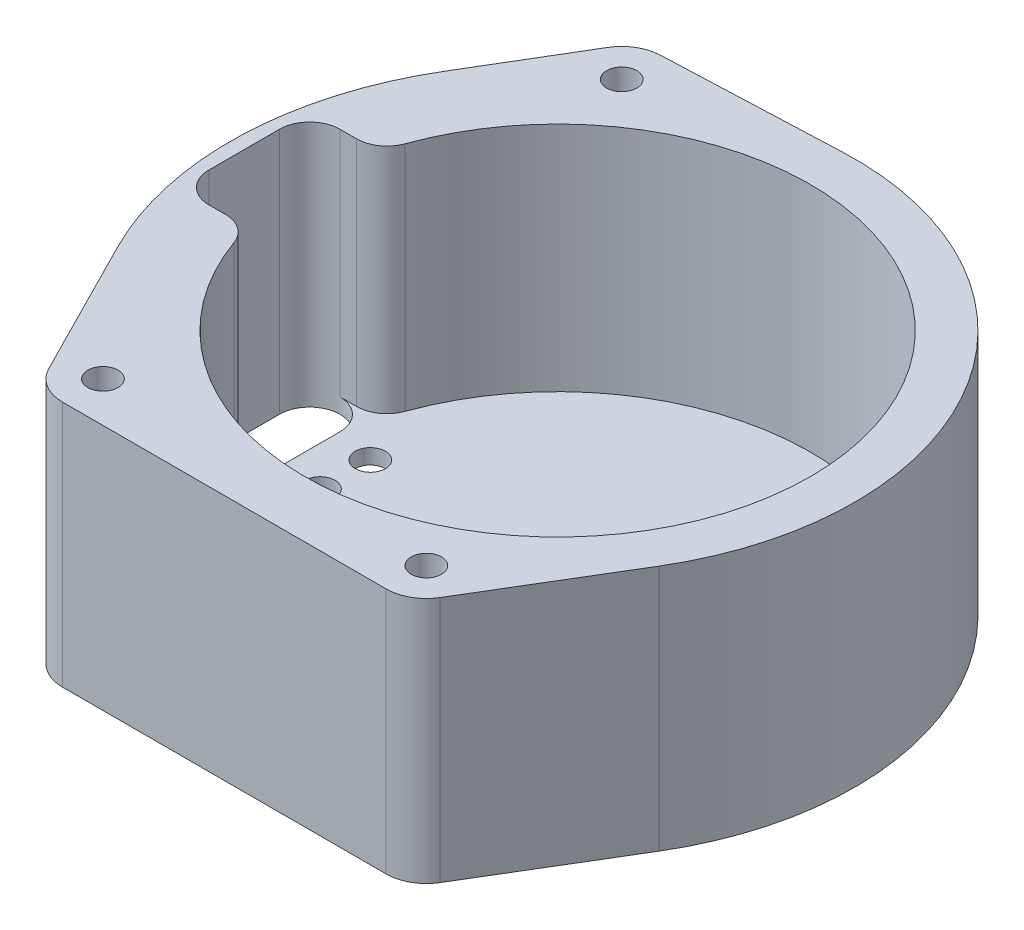
ISO-10303-21;
HEADER;
FILE_DESCRIPTION(('STEP AP214'),'2;1');
FILE_NAME('part.step','',(''),(''),'','','');
FILE_SCHEMA(('AUTOMOTIVE_DESIGN { 1 0 10303 214 1 1 1 1 }'));
ENDSEC;
DATA;
#1=APPLICATION_CONTEXT('core data for automotive mechanical design processes');
#2=APPLICATION_PROTOCOL_DEFINITION('international standard','automotive_design',2000,#1);
#3=PRODUCT_CONTEXT('',#1,'mechanical');
#4=PRODUCT('Part','Part','',(#3));
#5=PRODUCT_RELATED_PRODUCT_CATEGORY('part','',(#4));
#6=PRODUCT_DEFINITION_FORMATION('','',#4);
#7=PRODUCT_DEFINITION_CONTEXT('part definition',#1,'design');
#8=PRODUCT_DEFINITION('design','',#6,#7);
#9=PRODUCT_DEFINITION_SHAPE('','',#8);
#10=(LENGTH_UNIT() NAMED_UNIT(*) SI_UNIT(.MILLI.,.METRE.));
#11=(NAMED_UNIT(*) PLANE_ANGLE_UNIT() SI_UNIT($,.RADIAN.));
#12=(NAMED_UNIT(*) SI_UNIT($,.STERADIAN.) SOLID_ANGLE_UNIT());
#13=UNCERTAINTY_MEASURE_WITH_UNIT(LENGTH_MEASURE(1.E-05),#10,'distance_accuracy_value','');
#14=(GEOMETRIC_REPRESENTATION_CONTEXT(3) GLOBAL_UNCERTAINTY_ASSIGNED_CONTEXT((#13)) GLOBAL_UNIT_ASSIGNED_CONTEXT((#10,
#11,#12)) REPRESENTATION_CONTEXT('',''));
#15=CARTESIAN_POINT('',(0.,0.,0.));
#16=DIRECTION('',(0.,0.,1.));
#17=DIRECTION('',(1.,0.,0.));
#18=AXIS2_PLACEMENT_3D('',#15,#16,#17);
#19=CARTESIAN_POINT('',(-18.4083036841292,23.,26.7110072700086));
#20=DIRECTION('',(0.,1.,0.));
#21=DIRECTION('',(0.,0.,-1.));
#22=AXIS2_PLACEMENT_3D('',#19,#20,#21);
#23=PLANE('',#22);
#24=CARTESIAN_POINT('',(-18.4083036841292,23.,26.7110072700086));
#25=DIRECTION('',(0.,-1.,0.));
#26=DIRECTION('',(0.,0.,-1.));
#27=AXIS2_PLACEMENT_3D('',#24,#25,#26);
#28=CIRCLE('',#27,1.5);
#29=CARTESIAN_POINT('',(-18.4083036841292,23.,25.2110072700086));
#30=VERTEX_POINT('',#29);
#31=EDGE_CURVE('E274',#30,#30,#28,.T.);
#32=ORIENTED_EDGE('',*,*,#31,.T.);
#33=EDGE_LOOP('',(#32));
#34=FACE_BOUND('',#33,.T.);
#35=CARTESIAN_POINT('',(-18.4083036841292,23.,26.7110072700086));
#36=DIRECTION('',(0.,-1.,0.));
#37=DIRECTION('',(0.,0.,-1.));
#38=AXIS2_PLACEMENT_3D('',#35,#36,#37);
#39=CIRCLE('',#38,4.00000000000001);
#40=CARTESIAN_POINT('',(-18.4083036841292,23.,30.7110072700086));
#41=VERTEX_POINT('',#40);
#42=CARTESIAN_POINT('',(-21.9756650888363,23.,28.520408443935));
#43=VERTEX_POINT('',#42);
#44=EDGE_CURVE('E280',#41,#43,#39,.T.);
#45=ORIENTED_EDGE('',*,*,#44,.F.);
#46=DIRECTION('',(-1.,0.,0.));
#47=VECTOR('',#46,1.);
#48=CARTESIAN_POINT('',(-18.4083036841292,23.,30.7110072700086));
#49=LINE('',#48,#47);
#50=CARTESIAN_POINT('',(13.6880172568585,23.,30.7110072700086));
#51=VERTEX_POINT('',#50);
#52=EDGE_CURVE('E307',#51,#41,#49,.T.);
#53=ORIENTED_EDGE('',*,*,#52,.F.);
#54=CARTESIAN_POINT('',(13.6880172568585,23.,26.7110072700086));
#55=DIRECTION('',(0.,-1.,0.));
#56=DIRECTION('',(0.,0.,-1.));
#57=AXIS2_PLACEMENT_3D('',#54,#55,#56);
#58=CIRCLE('',#57,3.99999999999999);
#59=CARTESIAN_POINT('',(17.1153988864222,23.,28.7733009361312));
#60=VERTEX_POINT('',#59);
#61=EDGE_CURVE('E304',#60,#51,#58,.T.);
#62=ORIENTED_EDGE('',*,*,#61,.F.);
#63=DIRECTION('',(-0.515573416530637,0.,0.856845407390928));
#64=VECTOR('',#63,1.);
#65=CARTESIAN_POINT('',(17.1153988864222,23.,28.7733009361312));
#66=LINE('',#65,#64);
#67=CARTESIAN_POINT('',(25.2769395180324,23.,15.2094157876538));
#68=VERTEX_POINT('',#67);
#69=EDGE_CURVE('E301',#68,#60,#66,.T.);
#70=ORIENTED_EDGE('',*,*,#69,.F.);
#71=CARTESIAN_POINT('',(0.,23.,0.));
#72=DIRECTION('',(0.,-1.,0.));
#73=DIRECTION('',(0.,0.,-1.));
#74=AXIS2_PLACEMENT_3D('',#71,#72,#73);
#75=CIRCLE('',#74,29.5);
#76=CARTESIAN_POINT('',(-1.20515878453155,23.,-29.4753726406311));
#77=VERTEX_POINT('',#76);
#78=EDGE_CURVE('E298',#77,#68,#75,.T.);
#79=ORIENTED_EDGE('',*,*,#78,.F.);
#80=DIRECTION('',(0.999165174258683,0.,-0.0408528401536111));
#81=VECTOR('',#80,1.);
#82=CARTESIAN_POINT('',(-18.5717150447436,23.,-28.7653067123991));
#83=LINE('',#82,#81);
#84=CARTESIAN_POINT('',(-18.5717150447436,23.,-28.7653067123991));
#85=VERTEX_POINT('',#84);
#86=EDGE_CURVE('E295',#85,#77,#83,.T.);
#87=ORIENTED_EDGE('',*,*,#86,.F.);
#88=CARTESIAN_POINT('',(-18.4083036841292,23.,-24.7686460153643));
#89=DIRECTION('',(0.,-1.,0.));
#90=DIRECTION('',(0.,0.,-1.));
#91=AXIS2_PLACEMENT_3D('',#88,#89,#90);
#92=CIRCLE('',#91,4.);
#93=CARTESIAN_POINT('',(-21.8432095508813,23.,-26.8183829952113));
#94=VERTEX_POINT('',#93);
#95=EDGE_CURVE('E292',#94,#85,#92,.T.);
#96=ORIENTED_EDGE('',*,*,#95,.F.);
#97=DIRECTION('',(0.512434244961728,0.,-0.858726466688027));
#98=VECTOR('',#97,1.);
#99=CARTESIAN_POINT('',(-21.8432095508813,23.,-26.8183829952113));
#100=LINE('',#99,#98);
#101=CARTESIAN_POINT('',(-27.9086101673609,23.,-16.6541129612562));
#102=VERTEX_POINT('',#101);
#103=EDGE_CURVE('E289',#102,#94,#100,.T.);
#104=ORIENTED_EDGE('',*,*,#103,.F.);
#105=CARTESIAN_POINT('',(0.,23.,0.));
#106=DIRECTION('',(0.,-1.,0.));
#107=DIRECTION('',(0.,0.,-1.));
#108=AXIS2_PLACEMENT_3D('',#105,#106,#107);
#109=CIRCLE('',#108,32.5);
#110=CARTESIAN_POINT('',(-28.9848114132452,23.,14.701384538152));
#111=VERTEX_POINT('',#110);
#112=EDGE_CURVE('E286',#111,#102,#109,.T.);
#113=ORIENTED_EDGE('',*,*,#112,.F.);
#114=DIRECTION('',(-0.452350293481598,0.,-0.891840351176774));
#115=VECTOR('',#114,1.);
#116=CARTESIAN_POINT('',(-28.9848114132452,23.,14.7013845381519));
#117=LINE('',#116,#115);
#118=EDGE_CURVE('E283',#43,#111,#117,.T.);
#119=ORIENTED_EDGE('',*,*,#118,.F.);
#120=EDGE_LOOP('',(#45,#53,#62,#70,#79,#87,#96,#104,#113,#119));
#121=FACE_BOUND('',#120,.T.);
#122=CARTESIAN_POINT('',(13.6880172568585,23.,26.7110072700086));
#123=DIRECTION('',(0.,-1.,0.));
#124=DIRECTION('',(0.,0.,-1.));
#125=AXIS2_PLACEMENT_3D('',#122,#123,#124);
#126=CIRCLE('',#125,1.5);
#127=CARTESIAN_POINT('',(13.6880172568585,23.,25.2110072700086));
#128=VERTEX_POINT('',#127);
#129=EDGE_CURVE('E277',#128,#128,#126,.T.);
#130=ORIENTED_EDGE('',*,*,#129,.T.);
#131=EDGE_LOOP('',(#130));
#132=FACE_BOUND('',#131,.T.);
#133=CARTESIAN_POINT('',(-18.4083036841292,23.,-24.7686460153643));
#134=DIRECTION('',(0.,-1.,0.));
#135=DIRECTION('',(0.,0.,-1.));
#136=AXIS2_PLACEMENT_3D('',#133,#134,#135);
#137=CIRCLE('',#136,1.5);
#138=CARTESIAN_POINT('',(-18.4083036841292,23.,-26.2686460153643));
#139=VERTEX_POINT('',#138);
#140=EDGE_CURVE('E265',#139,#139,#137,.T.);
#141=ORIENTED_EDGE('',*,*,#140,.T.);
#142=EDGE_LOOP('',(#141));
#143=FACE_BOUND('',#142,.T.);
#144=CARTESIAN_POINT('',(0.,23.,0.));
#145=DIRECTION('',(0.,-1.,0.));
#146=DIRECTION('',(0.,0.,-1.));
#147=AXIS2_PLACEMENT_3D('',#144,#145,#146);
#148=CIRCLE('',#147,25.1);
#149=CARTESIAN_POINT('',(-23.6220615156866,23.,-8.48576512455516));
#150=VERTEX_POINT('',#149);
#151=CARTESIAN_POINT('',(-23.6220615156866,23.,8.48576512455516));
#152=VERTEX_POINT('',#151);
#153=EDGE_CURVE('E256',#150,#152,#148,.T.);
#154=ORIENTED_EDGE('',*,*,#153,.T.);
#155=CARTESIAN_POINT('',(-26.445415481705,23.,9.5));
#156=DIRECTION('',(0.,-1.,0.));
#157=DIRECTION('',(0.,0.,-1.));
#158=AXIS2_PLACEMENT_3D('',#155,#156,#157);
#159=CIRCLE('',#158,3.);
#160=CARTESIAN_POINT('',(-26.445415481705,23.,6.5));
#161=VERTEX_POINT('',#160);
#162=EDGE_CURVE('E354',#161,#152,#159,.T.);
#163=ORIENTED_EDGE('',*,*,#162,.F.);
#164=DIRECTION('',(-1.,0.,0.));
#165=VECTOR('',#164,1.);
#166=CARTESIAN_POINT('',(-31.1,23.,6.5));
#167=LINE('',#166,#165);
#168=CARTESIAN_POINT('',(-28.1,23.,6.5));
#169=VERTEX_POINT('',#168);
#170=EDGE_CURVE('E260',#161,#169,#167,.T.);
#171=ORIENTED_EDGE('',*,*,#170,.T.);
#172=CARTESIAN_POINT('',(-28.1,23.,3.5));
#173=DIRECTION('',(0.,-1.,0.));
#174=DIRECTION('',(0.,0.,-1.));
#175=AXIS2_PLACEMENT_3D('',#172,#173,#174);
#176=CIRCLE('',#175,3.);
#177=CARTESIAN_POINT('',(-31.1,23.,3.5));
#178=VERTEX_POINT('',#177);
#179=EDGE_CURVE('E11',#178,#169,#176,.F.);
#180=ORIENTED_EDGE('',*,*,#179,.F.);
#181=DIRECTION('',(0.,0.,-1.));
#182=VECTOR('',#181,1.);
#183=CARTESIAN_POINT('',(-31.1,23.,-6.5));
#184=LINE('',#183,#182);
#185=CARTESIAN_POINT('',(-31.1,23.,-3.5));
#186=VERTEX_POINT('',#185);
#187=EDGE_CURVE('E263',#178,#186,#184,.T.);
#188=ORIENTED_EDGE('',*,*,#187,.T.);
#189=CARTESIAN_POINT('',(-28.1,23.,-3.5));
#190=DIRECTION('',(0.,-1.,0.));
#191=DIRECTION('',(0.,0.,-1.));
#192=AXIS2_PLACEMENT_3D('',#189,#190,#191);
#193=CIRCLE('',#192,3.);
#194=CARTESIAN_POINT('',(-28.1,23.,-6.5));
#195=VERTEX_POINT('',#194);
#196=EDGE_CURVE('E45',#195,#186,#193,.F.);
#197=ORIENTED_EDGE('',*,*,#196,.F.);
#198=DIRECTION('',(1.,0.,0.));
#199=VECTOR('',#198,1.);
#200=CARTESIAN_POINT('',(-31.1,23.,-6.5));
#201=LINE('',#200,#199);
#202=CARTESIAN_POINT('',(-26.445415481705,23.,-6.5));
#203=VERTEX_POINT('',#202);
#204=EDGE_CURVE('E253',#195,#203,#201,.T.);
#205=ORIENTED_EDGE('',*,*,#204,.T.);
#206=CARTESIAN_POINT('',(-26.445415481705,23.,-9.5));
#207=DIRECTION('',(0.,-1.,0.));
#208=DIRECTION('',(0.,0.,-1.));
#209=AXIS2_PLACEMENT_3D('',#206,#207,#208);
#210=CIRCLE('',#209,3.);
#211=EDGE_CURVE('E356',#150,#203,#210,.T.);
#212=ORIENTED_EDGE('',*,*,#211,.F.);
#213=EDGE_LOOP('',(#154,#163,#171,#180,#188,#197,#205,#212));
#214=FACE_BOUND('',#213,.T.);
#215=ADVANCED_FACE('F37',(#34,#121,#132,#143,#214),#23,.T.);
#216=CARTESIAN_POINT('',(-18.4083036841292,23.,26.7110072700086));
#217=DIRECTION('',(0.,-1.,0.));
#218=DIRECTION('',(0.,0.,1.));
#219=AXIS2_PLACEMENT_3D('',#216,#217,#218);
#220=CYLINDRICAL_SURFACE('',#219,4.00000000000001);
#221=DIRECTION('',(0.,-1.,0.));
#222=VECTOR('',#221,1.);
#223=CARTESIAN_POINT('',(-18.4083036841292,23.,30.7110072700086));
#224=LINE('',#223,#222);
#225=CARTESIAN_POINT('',(-18.4083036841292,-1.5,30.7110072700086));
#226=VERTEX_POINT('',#225);
#227=EDGE_CURVE('E310',#41,#226,#224,.T.);
#228=ORIENTED_EDGE('',*,*,#227,.F.);
#229=ORIENTED_EDGE('',*,*,#44,.T.);
#230=DIRECTION('',(0.,-1.,0.));
#231=VECTOR('',#230,1.);
#232=CARTESIAN_POINT('',(-21.9756650888363,23.,28.520408443935));
#233=LINE('',#232,#231);
#234=CARTESIAN_POINT('',(-21.9756650888363,-1.5,28.520408443935));
#235=VERTEX_POINT('',#234);
#236=EDGE_CURVE('E337',#43,#235,#233,.T.);
#237=ORIENTED_EDGE('',*,*,#236,.T.);
#238=CARTESIAN_POINT('',(-18.4083036841292,-1.5,26.7110072700086));
#239=DIRECTION('',(0.,1.,0.));
#240=DIRECTION('',(0.,0.,1.));
#241=AXIS2_PLACEMENT_3D('',#238,#239,#240);
#242=CIRCLE('',#241,4.);
#243=EDGE_CURVE('E229',#235,#226,#242,.T.);
#244=ORIENTED_EDGE('',*,*,#243,.T.);
#245=EDGE_LOOP('',(#228,#229,#237,#244));
#246=FACE_BOUND('',#245,.T.);
#247=ADVANCED_FACE('F395',(#246),#220,.T.);
#248=CARTESIAN_POINT('',(-28.9848114132452,23.,14.7013845381519));
#249=DIRECTION('',(0.891840351176774,0.,-0.452350293481598));
#250=DIRECTION('',(0.452350293481598,0.,0.891840351176775));
#251=AXIS2_PLACEMENT_3D('',#248,#249,#250);
#252=PLANE('',#251);
#253=ORIENTED_EDGE('',*,*,#236,.F.);
#254=ORIENTED_EDGE('',*,*,#118,.T.);
#255=DIRECTION('',(0.,-1.,0.));
#256=VECTOR('',#255,1.);
#257=CARTESIAN_POINT('',(-28.9848114132452,23.,14.701384538152));
#258=LINE('',#257,#256);
#259=CARTESIAN_POINT('',(-28.9848114132452,-1.5,14.701384538152));
#260=VERTEX_POINT('',#259);
#261=EDGE_CURVE('E334',#111,#260,#258,.T.);
#262=ORIENTED_EDGE('',*,*,#261,.T.);
#263=DIRECTION('',(0.452350293481598,0.,0.891840351176774));
#264=VECTOR('',#263,1.);
#265=CARTESIAN_POINT('',(-28.9848114132452,-1.5,14.701384538152));
#266=LINE('',#265,#264);
#267=EDGE_CURVE('E250',#260,#235,#266,.T.);
#268=ORIENTED_EDGE('',*,*,#267,.T.);
#269=EDGE_LOOP('',(#253,#254,#262,#268));
#270=FACE_BOUND('',#269,.T.);
#271=ADVANCED_FACE('F401',(#270),#252,.F.);
#272=CARTESIAN_POINT('',(0.,23.,0.));
#273=DIRECTION('',(0.,-1.,0.));
#274=DIRECTION('',(0.,0.,1.));
#275=AXIS2_PLACEMENT_3D('',#272,#273,#274);
#276=CYLINDRICAL_SURFACE('',#275,32.5);
#277=ORIENTED_EDGE('',*,*,#261,.F.);
#278=ORIENTED_EDGE('',*,*,#112,.T.);
#279=DIRECTION('',(0.,-1.,0.));
#280=VECTOR('',#279,1.);
#281=CARTESIAN_POINT('',(-27.9086101673609,23.,-16.6541129612562));
#282=LINE('',#281,#280);
#283=CARTESIAN_POINT('',(-27.9086101673609,-1.5,-16.6541129612562));
#284=VERTEX_POINT('',#283);
#285=EDGE_CURVE('E331',#102,#284,#282,.T.);
#286=ORIENTED_EDGE('',*,*,#285,.T.);
#287=CARTESIAN_POINT('',(0.,-1.5,0.));
#288=DIRECTION('',(0.,1.,0.));
#289=DIRECTION('',(0.,0.,1.));
#290=AXIS2_PLACEMENT_3D('',#287,#288,#289);
#291=CIRCLE('',#290,32.5);
#292=EDGE_CURVE('E248',#284,#260,#291,.T.);
#293=ORIENTED_EDGE('',*,*,#292,.T.);
#294=EDGE_LOOP('',(#277,#278,#286,#293));
#295=FACE_BOUND('',#294,.T.);
#296=ADVANCED_FACE('F436',(#295),#276,.T.);
#297=CARTESIAN_POINT('',(-21.8432095508813,23.,-26.8183829952113));
#298=DIRECTION('',(0.858726466688028,0.,0.512434244961728));
#299=DIRECTION('',(-0.512434244961728,0.,0.858726466688028));
#300=AXIS2_PLACEMENT_3D('',#297,#298,#299);
#301=PLANE('',#300);
#302=ORIENTED_EDGE('',*,*,#285,.F.);
#303=ORIENTED_EDGE('',*,*,#103,.T.);
#304=DIRECTION('',(0.,-1.,0.));
#305=VECTOR('',#304,1.);
#306=CARTESIAN_POINT('',(-21.8432095508813,23.,-26.8183829952113));
#307=LINE('',#306,#305);
#308=CARTESIAN_POINT('',(-21.8432095508813,-1.5,-26.8183829952113));
#309=VERTEX_POINT('',#308);
#310=EDGE_CURVE('E328',#94,#309,#307,.T.);
#311=ORIENTED_EDGE('',*,*,#310,.T.);
#312=DIRECTION('',(-0.512434244961728,0.,0.858726466688027));
#313=VECTOR('',#312,1.);
#314=CARTESIAN_POINT('',(-21.8432095508813,-1.5,-26.8183829952113));
#315=LINE('',#314,#313);
#316=EDGE_CURVE('E246',#309,#284,#315,.T.);
#317=ORIENTED_EDGE('',*,*,#316,.T.);
#318=EDGE_LOOP('',(#302,#303,#311,#317));
#319=FACE_BOUND('',#318,.T.);
#320=ADVANCED_FACE('F432',(#319),#301,.F.);
#321=CARTESIAN_POINT('',(-18.4083036841292,23.,-24.7686460153643));
#322=DIRECTION('',(0.,-1.,0.));
#323=DIRECTION('',(0.,0.,1.));
#324=AXIS2_PLACEMENT_3D('',#321,#322,#323);
#325=CYLINDRICAL_SURFACE('',#324,4.);
#326=ORIENTED_EDGE('',*,*,#310,.F.);
#327=ORIENTED_EDGE('',*,*,#95,.T.);
#328=DIRECTION('',(0.,-1.,0.));
#329=VECTOR('',#328,1.);
#330=CARTESIAN_POINT('',(-18.5717150447436,23.,-28.7653067123991));
#331=LINE('',#330,#329);
#332=CARTESIAN_POINT('',(-18.5717150447436,-1.5,-28.7653067123991));
#333=VERTEX_POINT('',#332);
#334=EDGE_CURVE('E325',#85,#333,#331,.T.);
#335=ORIENTED_EDGE('',*,*,#334,.T.);
#336=CARTESIAN_POINT('',(-18.4083036841292,-1.5,-24.7686460153643));
#337=DIRECTION('',(0.,1.,0.));
#338=DIRECTION('',(0.,0.,1.));
#339=AXIS2_PLACEMENT_3D('',#336,#337,#338);
#340=CIRCLE('',#339,4.);
#341=EDGE_CURVE('E244',#333,#309,#340,.T.);
#342=ORIENTED_EDGE('',*,*,#341,.T.);
#343=EDGE_LOOP('',(#326,#327,#335,#342));
#344=FACE_BOUND('',#343,.T.);
#345=ADVANCED_FACE('F428',(#344),#325,.T.);
#346=CARTESIAN_POINT('',(-18.5717150447436,23.,-28.7653067123991));
#347=DIRECTION('',(0.0408528401536111,0.,0.999165174258682));
#348=DIRECTION('',(-0.999165174258683,0.,0.0408528401536111));
#349=AXIS2_PLACEMENT_3D('',#346,#347,#348);
#350=PLANE('',#349);
#351=ORIENTED_EDGE('',*,*,#334,.F.);
#352=ORIENTED_EDGE('',*,*,#86,.T.);
#353=DIRECTION('',(0.,-1.,0.));
#354=VECTOR('',#353,1.);
#355=CARTESIAN_POINT('',(-1.20515878453155,23.,-29.4753726406311));
#356=LINE('',#355,#354);
#357=CARTESIAN_POINT('',(-1.20515878453154,-1.5,-29.4753726406311));
#358=VERTEX_POINT('',#357);
#359=EDGE_CURVE('E322',#77,#358,#356,.T.);
#360=ORIENTED_EDGE('',*,*,#359,.T.);
#361=DIRECTION('',(-0.999165174258683,0.,0.0408528401536111));
#362=VECTOR('',#361,1.);
#363=CARTESIAN_POINT('',(-1.20515878453154,-1.5,-29.4753726406311));
#364=LINE('',#363,#362);
#365=EDGE_CURVE('E242',#358,#333,#364,.T.);
#366=ORIENTED_EDGE('',*,*,#365,.T.);
#367=EDGE_LOOP('',(#351,#352,#360,#366));
#368=FACE_BOUND('',#367,.T.);
#369=ADVANCED_FACE('F424',(#368),#350,.F.);
#370=CARTESIAN_POINT('',(0.,23.,0.));
#371=DIRECTION('',(0.,-1.,0.));
#372=DIRECTION('',(0.,0.,1.));
#373=AXIS2_PLACEMENT_3D('',#370,#371,#372);
#374=CYLINDRICAL_SURFACE('',#373,29.5);
#375=ORIENTED_EDGE('',*,*,#359,.F.);
#376=ORIENTED_EDGE('',*,*,#78,.T.);
#377=DIRECTION('',(0.,-1.,0.));
#378=VECTOR('',#377,1.);
#379=CARTESIAN_POINT('',(25.2769395180324,23.,15.2094157876538));
#380=LINE('',#379,#378);
#381=CARTESIAN_POINT('',(25.2769395180324,-1.5,15.2094157876538));
#382=VERTEX_POINT('',#381);
#383=EDGE_CURVE('E319',#68,#382,#380,.T.);
#384=ORIENTED_EDGE('',*,*,#383,.T.);
#385=CARTESIAN_POINT('',(0.,-1.5,0.));
#386=DIRECTION('',(0.,1.,0.));
#387=DIRECTION('',(0.,0.,1.));
#388=AXIS2_PLACEMENT_3D('',#385,#386,#387);
#389=CIRCLE('',#388,29.5);
#390=EDGE_CURVE('E240',#382,#358,#389,.T.);
#391=ORIENTED_EDGE('',*,*,#390,.T.);
#392=EDGE_LOOP('',(#375,#376,#384,#391));
#393=FACE_BOUND('',#392,.T.);
#394=ADVANCED_FACE('F420',(#393),#374,.T.);
#395=CARTESIAN_POINT('',(17.1153988864222,23.,28.7733009361312));
#396=DIRECTION('',(-0.856845407390929,0.,-0.515573416530637));
#397=DIRECTION('',(0.515573416530637,0.,-0.856845407390929));
#398=AXIS2_PLACEMENT_3D('',#395,#396,#397);
#399=PLANE('',#398);
#400=ORIENTED_EDGE('',*,*,#383,.F.);
#401=ORIENTED_EDGE('',*,*,#69,.T.);
#402=DIRECTION('',(0.,-1.,0.));
#403=VECTOR('',#402,1.);
#404=CARTESIAN_POINT('',(17.1153988864222,23.,28.7733009361312));
#405=LINE('',#404,#403);
#406=CARTESIAN_POINT('',(17.1153988864222,-1.5,28.7733009361312));
#407=VERTEX_POINT('',#406);
#408=EDGE_CURVE('E316',#60,#407,#405,.T.);
#409=ORIENTED_EDGE('',*,*,#408,.T.);
#410=DIRECTION('',(0.515573416530637,0.,-0.856845407390929));
#411=VECTOR('',#410,1.);
#412=CARTESIAN_POINT('',(17.1153988864222,-1.5,28.7733009361312));
#413=LINE('',#412,#411);
#414=EDGE_CURVE('E238',#407,#382,#413,.T.);
#415=ORIENTED_EDGE('',*,*,#414,.T.);
#416=EDGE_LOOP('',(#400,#401,#409,#415));
#417=FACE_BOUND('',#416,.T.);
#418=ADVANCED_FACE('F416',(#417),#399,.F.);
#419=CARTESIAN_POINT('',(13.6880172568585,23.,26.7110072700086));
#420=DIRECTION('',(0.,-1.,0.));
#421=DIRECTION('',(0.,0.,1.));
#422=AXIS2_PLACEMENT_3D('',#419,#420,#421);
#423=CYLINDRICAL_SURFACE('',#422,3.99999999999999);
#424=ORIENTED_EDGE('',*,*,#408,.F.);
#425=ORIENTED_EDGE('',*,*,#61,.T.);
#426=DIRECTION('',(0.,-1.,0.));
#427=VECTOR('',#426,1.);
#428=CARTESIAN_POINT('',(13.6880172568585,23.,30.7110072700086));
#429=LINE('',#428,#427);
#430=CARTESIAN_POINT('',(13.6880172568585,-1.5,30.7110072700086));
#431=VERTEX_POINT('',#430);
#432=EDGE_CURVE('E313',#51,#431,#429,.T.);
#433=ORIENTED_EDGE('',*,*,#432,.T.);
#434=CARTESIAN_POINT('',(13.6880172568585,-1.5,26.7110072700086));
#435=DIRECTION('',(0.,1.,0.));
#436=DIRECTION('',(0.,0.,1.));
#437=AXIS2_PLACEMENT_3D('',#434,#435,#436);
#438=CIRCLE('',#437,4.);
#439=EDGE_CURVE('E236',#431,#407,#438,.T.);
#440=ORIENTED_EDGE('',*,*,#439,.T.);
#441=EDGE_LOOP('',(#424,#425,#433,#440));
#442=FACE_BOUND('',#441,.T.);
#443=ADVANCED_FACE('F412',(#442),#423,.T.);
#444=CARTESIAN_POINT('',(-18.4083036841292,23.,30.7110072700086));
#445=DIRECTION('',(0.,0.,-1.));
#446=DIRECTION('',(1.,0.,0.));
#447=AXIS2_PLACEMENT_3D('',#444,#445,#446);
#448=PLANE('',#447);
#449=ORIENTED_EDGE('',*,*,#432,.F.);
#450=ORIENTED_EDGE('',*,*,#52,.T.);
#451=ORIENTED_EDGE('',*,*,#227,.T.);
#452=DIRECTION('',(1.,0.,0.));
#453=VECTOR('',#452,1.);
#454=CARTESIAN_POINT('',(-18.4083036841292,-1.5,30.7110072700086));
#455=LINE('',#454,#453);
#456=EDGE_CURVE('E234',#226,#431,#455,.T.);
#457=ORIENTED_EDGE('',*,*,#456,.T.);
#458=EDGE_LOOP('',(#449,#450,#451,#457));
#459=FACE_BOUND('',#458,.T.);
#460=ADVANCED_FACE('F409',(#459),#448,.F.);
#461=CARTESIAN_POINT('',(13.6880172568585,23.,26.7110072700086));
#462=DIRECTION('',(0.,-1.,0.));
#463=DIRECTION('',(0.,0.,1.));
#464=AXIS2_PLACEMENT_3D('',#461,#462,#463);
#465=CYLINDRICAL_SURFACE('',#464,1.5);
#466=ORIENTED_EDGE('',*,*,#129,.F.);
#467=EDGE_LOOP('',(#466));
#468=FACE_BOUND('',#467,.T.);
#469=CARTESIAN_POINT('',(13.6880172568585,-1.5,26.7110072700086));
#470=DIRECTION('',(0.,1.,0.));
#471=DIRECTION('',(0.,0.,1.));
#472=AXIS2_PLACEMENT_3D('',#469,#470,#471);
#473=CIRCLE('',#472,1.5);
#474=CARTESIAN_POINT('',(13.6880172568585,-1.5,28.2110072700086));
#475=VERTEX_POINT('',#474);
#476=EDGE_CURVE('E222',#475,#475,#473,.T.);
#477=ORIENTED_EDGE('',*,*,#476,.F.);
#478=EDGE_LOOP('',(#477));
#479=FACE_BOUND('',#478,.T.);
#480=ADVANCED_FACE('F407',(#468,#479),#465,.F.);
#481=CARTESIAN_POINT('',(-18.4083036841292,23.,26.7110072700086));
#482=DIRECTION('',(0.,-1.,0.));
#483=DIRECTION('',(0.,0.,1.));
#484=AXIS2_PLACEMENT_3D('',#481,#482,#483);
#485=CYLINDRICAL_SURFACE('',#484,1.5);
#486=ORIENTED_EDGE('',*,*,#31,.F.);
#487=EDGE_LOOP('',(#486));
#488=FACE_BOUND('',#487,.T.);
#489=CARTESIAN_POINT('',(-18.4083036841292,-1.5,26.7110072700086));
#490=DIRECTION('',(0.,1.,0.));
#491=DIRECTION('',(0.,0.,1.));
#492=AXIS2_PLACEMENT_3D('',#489,#490,#491);
#493=CIRCLE('',#492,1.5);
#494=CARTESIAN_POINT('',(-18.4083036841292,-1.5,28.2110072700086));
#495=VERTEX_POINT('',#494);
#496=EDGE_CURVE('E219',#495,#495,#493,.T.);
#497=ORIENTED_EDGE('',*,*,#496,.F.);
#498=EDGE_LOOP('',(#497));
#499=FACE_BOUND('',#498,.T.);
#500=ADVANCED_FACE('F477',(#488,#499),#485,.F.);
#501=CARTESIAN_POINT('',(-18.4083036841292,23.,-24.7686460153643));
#502=DIRECTION('',(0.,-1.,0.));
#503=DIRECTION('',(0.,0.,1.));
#504=AXIS2_PLACEMENT_3D('',#501,#502,#503);
#505=CYLINDRICAL_SURFACE('',#504,1.5);
#506=ORIENTED_EDGE('',*,*,#140,.F.);
#507=EDGE_LOOP('',(#506));
#508=FACE_BOUND('',#507,.T.);
#509=CARTESIAN_POINT('',(-18.4083036841292,-1.5,-24.7686460153643));
#510=DIRECTION('',(0.,1.,0.));
#511=DIRECTION('',(0.,0.,1.));
#512=AXIS2_PLACEMENT_3D('',#509,#510,#511);
#513=CIRCLE('',#512,1.5);
#514=CARTESIAN_POINT('',(-18.4083036841292,-1.5,-23.2686460153643));
#515=VERTEX_POINT('',#514);
#516=EDGE_CURVE('E216',#515,#515,#513,.T.);
#517=ORIENTED_EDGE('',*,*,#516,.F.);
#518=EDGE_LOOP('',(#517));
#519=FACE_BOUND('',#518,.T.);
#520=ADVANCED_FACE('F475',(#508,#519),#505,.F.);
#521=CARTESIAN_POINT('',(-31.1,23.,-6.5));
#522=DIRECTION('',(0.,0.,1.));
#523=DIRECTION('',(-1.,0.,0.));
#524=AXIS2_PLACEMENT_3D('',#521,#522,#523);
#525=PLANE('',#524);
#526=ORIENTED_EDGE('',*,*,#204,.F.);
#527=DIRECTION('',(0.,-1.,0.));
#528=VECTOR('',#527,1.);
#529=CARTESIAN_POINT('',(-28.1,23.,-6.5));
#530=LINE('',#529,#528);
#531=CARTESIAN_POINT('',(-28.1,0.,-6.5));
#532=VERTEX_POINT('',#531);
#533=EDGE_CURVE('E340',#532,#195,#530,.F.);
#534=ORIENTED_EDGE('',*,*,#533,.F.);
#535=DIRECTION('',(1.,0.,0.));
#536=VECTOR('',#535,1.);
#537=CARTESIAN_POINT('',(-31.1,0.,-6.5));
#538=LINE('',#537,#536);
#539=CARTESIAN_POINT('',(-26.445415481705,0.,-6.5));
#540=VERTEX_POINT('',#539);
#541=EDGE_CURVE('E252',#532,#540,#538,.T.);
#542=ORIENTED_EDGE('',*,*,#541,.T.);
#543=DIRECTION('',(0.,-1.,0.));
#544=VECTOR('',#543,1.);
#545=CARTESIAN_POINT('',(-26.445415481705,23.,-6.5));
#546=LINE('',#545,#544);
#547=EDGE_CURVE('E342',#203,#540,#546,.T.);
#548=ORIENTED_EDGE('',*,*,#547,.F.);
#549=EDGE_LOOP('',(#526,#534,#542,#548));
#550=FACE_BOUND('',#549,.T.);
#551=ADVANCED_FACE('F378',(#550),#525,.T.);
#552=CARTESIAN_POINT('',(0.,23.,0.));
#553=DIRECTION('',(0.,-1.,0.));
#554=DIRECTION('',(0.,0.,1.));
#555=AXIS2_PLACEMENT_3D('',#552,#553,#554);
#556=CYLINDRICAL_SURFACE('',#555,25.1);
#557=CARTESIAN_POINT('',(0.,0.,0.));
#558=DIRECTION('',(0.,-1.,0.));
#559=DIRECTION('',(0.,0.,-1.));
#560=AXIS2_PLACEMENT_3D('',#557,#558,#559);
#561=CIRCLE('',#560,25.1);
#562=CARTESIAN_POINT('',(-23.6220615156866,0.,-8.48576512455516));
#563=VERTEX_POINT('',#562);
#564=CARTESIAN_POINT('',(-23.6220615156866,0.,8.48576512455516));
#565=VERTEX_POINT('',#564);
#566=EDGE_CURVE('E268',#563,#565,#561,.T.);
#567=ORIENTED_EDGE('',*,*,#566,.T.);
#568=DIRECTION('',(0.,-1.,0.));
#569=VECTOR('',#568,1.);
#570=CARTESIAN_POINT('',(-23.6220615156866,23.,8.48576512455516));
#571=LINE('',#570,#569);
#572=EDGE_CURVE('E349',#152,#565,#571,.T.);
#573=ORIENTED_EDGE('',*,*,#572,.F.);
#574=ORIENTED_EDGE('',*,*,#153,.F.);
#575=DIRECTION('',(0.,-1.,0.));
#576=VECTOR('',#575,1.);
#577=CARTESIAN_POINT('',(-23.6220615156866,23.,-8.48576512455516));
#578=LINE('',#577,#576);
#579=EDGE_CURVE('E352',#563,#150,#578,.F.);
#580=ORIENTED_EDGE('',*,*,#579,.F.);
#581=EDGE_LOOP('',(#567,#573,#574,#580));
#582=FACE_BOUND('',#581,.T.);
#583=ADVANCED_FACE('F384',(#582),#556,.F.);
#584=CARTESIAN_POINT('',(-31.1,23.,6.5));
#585=DIRECTION('',(0.,0.,-1.));
#586=DIRECTION('',(1.,0.,0.));
#587=AXIS2_PLACEMENT_3D('',#584,#585,#586);
#588=PLANE('',#587);
#589=DIRECTION('',(-1.,0.,0.));
#590=VECTOR('',#589,1.);
#591=CARTESIAN_POINT('',(-31.1,0.,6.5));
#592=LINE('',#591,#590);
#593=CARTESIAN_POINT('',(-26.445415481705,0.,6.5));
#594=VERTEX_POINT('',#593);
#595=CARTESIAN_POINT('',(-28.1,0.,6.5));
#596=VERTEX_POINT('',#595);
#597=EDGE_CURVE('E257',#594,#596,#592,.T.);
#598=ORIENTED_EDGE('',*,*,#597,.T.);
#599=DIRECTION('',(0.,-1.,0.));
#600=VECTOR('',#599,1.);
#601=CARTESIAN_POINT('',(-28.1,0.,6.5));
#602=LINE('',#601,#600);
#603=EDGE_CURVE('E52',#169,#596,#602,.T.);
#604=ORIENTED_EDGE('',*,*,#603,.F.);
#605=ORIENTED_EDGE('',*,*,#170,.F.);
#606=DIRECTION('',(0.,-1.,0.));
#607=VECTOR('',#606,1.);
#608=CARTESIAN_POINT('',(-26.445415481705,23.,6.5));
#609=LINE('',#608,#607);
#610=EDGE_CURVE('E59',#594,#161,#609,.F.);
#611=ORIENTED_EDGE('',*,*,#610,.F.);
#612=EDGE_LOOP('',(#598,#604,#605,#611));
#613=FACE_BOUND('',#612,.T.);
#614=ADVANCED_FACE('F366',(#613),#588,.T.);
#615=CARTESIAN_POINT('',(-31.1,23.,-6.5));
#616=DIRECTION('',(1.,0.,0.));
#617=DIRECTION('',(0.,0.,1.));
#618=AXIS2_PLACEMENT_3D('',#615,#616,#617);
#619=PLANE('',#618);
#620=ORIENTED_EDGE('',*,*,#187,.F.);
#621=DIRECTION('',(0.,-1.,0.));
#622=VECTOR('',#621,1.);
#623=CARTESIAN_POINT('',(-31.1,23.,3.5));
#624=LINE('',#623,#622);
#625=CARTESIAN_POINT('',(-31.1,-1.5,3.5));
#626=VERTEX_POINT('',#625);
#627=EDGE_CURVE('E195',#626,#178,#624,.F.);
#628=ORIENTED_EDGE('',*,*,#627,.F.);
#629=DIRECTION('',(0.,0.,1.));
#630=VECTOR('',#629,1.);
#631=CARTESIAN_POINT('',(-31.1,-1.5,-3.5));
#632=LINE('',#631,#630);
#633=CARTESIAN_POINT('',(-31.1,-1.5,-3.5));
#634=VERTEX_POINT('',#633);
#635=EDGE_CURVE('E180',#634,#626,#632,.T.);
#636=ORIENTED_EDGE('',*,*,#635,.F.);
#637=DIRECTION('',(0.,-1.,0.));
#638=VECTOR('',#637,1.);
#639=CARTESIAN_POINT('',(-31.1,0.,-3.5));
#640=LINE('',#639,#638);
#641=EDGE_CURVE('E189',#186,#634,#640,.T.);
#642=ORIENTED_EDGE('',*,*,#641,.F.);
#643=EDGE_LOOP('',(#620,#628,#636,#642));
#644=FACE_BOUND('',#643,.T.);
#645=ADVANCED_FACE('F197',(#644),#619,.T.);
#646=CARTESIAN_POINT('',(-26.445415481705,23.,-9.5));
#647=DIRECTION('',(0.,-1.,0.));
#648=DIRECTION('',(0.,0.,1.));
#649=AXIS2_PLACEMENT_3D('',#646,#647,#648);
#650=CYLINDRICAL_SURFACE('',#649,3.);
#651=ORIENTED_EDGE('',*,*,#211,.T.);
#652=ORIENTED_EDGE('',*,*,#547,.T.);
#653=CARTESIAN_POINT('',(-26.445415481705,0.,-9.5));
#654=DIRECTION('',(0.,-1.,0.));
#655=DIRECTION('',(0.,0.,-1.));
#656=AXIS2_PLACEMENT_3D('',#653,#654,#655);
#657=CIRCLE('',#656,3.);
#658=EDGE_CURVE('E347',#540,#563,#657,.F.);
#659=ORIENTED_EDGE('',*,*,#658,.T.);
#660=ORIENTED_EDGE('',*,*,#579,.T.);
#661=EDGE_LOOP('',(#651,#652,#659,#660));
#662=FACE_BOUND('',#661,.T.);
#663=ADVANCED_FACE('F387',(#662),#650,.T.);
#664=CARTESIAN_POINT('',(-26.445415481705,23.,9.5));
#665=DIRECTION('',(0.,-1.,0.));
#666=DIRECTION('',(0.,0.,1.));
#667=AXIS2_PLACEMENT_3D('',#664,#665,#666);
#668=CYLINDRICAL_SURFACE('',#667,3.);
#669=ORIENTED_EDGE('',*,*,#162,.T.);
#670=ORIENTED_EDGE('',*,*,#572,.T.);
#671=CARTESIAN_POINT('',(-26.445415481705,0.,9.5));
#672=DIRECTION('',(0.,-1.,0.));
#673=DIRECTION('',(0.,0.,-1.));
#674=AXIS2_PLACEMENT_3D('',#671,#672,#673);
#675=CIRCLE('',#674,3.);
#676=EDGE_CURVE('E345',#565,#594,#675,.F.);
#677=ORIENTED_EDGE('',*,*,#676,.T.);
#678=ORIENTED_EDGE('',*,*,#610,.T.);
#679=EDGE_LOOP('',(#669,#670,#677,#678));
#680=FACE_BOUND('',#679,.T.);
#681=ADVANCED_FACE('F385',(#680),#668,.T.);
#682=CARTESIAN_POINT('',(-28.1,23.,-3.5));
#683=DIRECTION('',(0.,1.,0.));
#684=DIRECTION('',(0.,0.,-1.));
#685=AXIS2_PLACEMENT_3D('',#682,#683,#684);
#686=CYLINDRICAL_SURFACE('',#685,3.);
#687=ORIENTED_EDGE('',*,*,#196,.T.);
#688=ORIENTED_EDGE('',*,*,#641,.T.);
#689=CARTESIAN_POINT('',(-28.1,-1.5,-3.5));
#690=DIRECTION('',(0.,1.,0.));
#691=DIRECTION('',(0.,0.,1.));
#692=AXIS2_PLACEMENT_3D('',#689,#690,#691);
#693=CIRCLE('',#692,3.);
#694=CARTESIAN_POINT('',(-25.1,-1.5,-3.5));
#695=VERTEX_POINT('',#694);
#696=EDGE_CURVE('E175',#695,#634,#693,.T.);
#697=ORIENTED_EDGE('',*,*,#696,.F.);
#698=DIRECTION('',(0.,1.,0.));
#699=VECTOR('',#698,1.);
#700=CARTESIAN_POINT('',(-25.1,-1.5,-3.5));
#701=LINE('',#700,#699);
#702=CARTESIAN_POINT('',(-25.1,0.,-3.5));
#703=VERTEX_POINT('',#702);
#704=EDGE_CURVE('E204',#695,#703,#701,.T.);
#705=ORIENTED_EDGE('',*,*,#704,.T.);
#706=CARTESIAN_POINT('',(-28.1,0.,-3.5));
#707=DIRECTION('',(0.,1.,0.));
#708=DIRECTION('',(0.,0.,1.));
#709=AXIS2_PLACEMENT_3D('',#706,#707,#708);
#710=CIRCLE('',#709,3.);
#711=EDGE_CURVE('E205',#703,#532,#710,.T.);
#712=ORIENTED_EDGE('',*,*,#711,.T.);
#713=ORIENTED_EDGE('',*,*,#533,.T.);
#714=EDGE_LOOP('',(#687,#688,#697,#705,#712,#713));
#715=FACE_BOUND('',#714,.T.);
#716=ADVANCED_FACE('F190',(#715),#686,.F.);
#717=CARTESIAN_POINT('',(-28.1,23.,3.5));
#718=DIRECTION('',(0.,1.,0.));
#719=DIRECTION('',(0.,0.,-1.));
#720=AXIS2_PLACEMENT_3D('',#717,#718,#719);
#721=CYLINDRICAL_SURFACE('',#720,3.);
#722=ORIENTED_EDGE('',*,*,#179,.T.);
#723=ORIENTED_EDGE('',*,*,#603,.T.);
#724=CARTESIAN_POINT('',(-28.1,0.,3.5));
#725=DIRECTION('',(0.,1.,0.));
#726=DIRECTION('',(0.,0.,1.));
#727=AXIS2_PLACEMENT_3D('',#724,#725,#726);
#728=CIRCLE('',#727,3.);
#729=CARTESIAN_POINT('',(-25.1,0.,3.5));
#730=VERTEX_POINT('',#729);
#731=EDGE_CURVE('E207',#596,#730,#728,.T.);
#732=ORIENTED_EDGE('',*,*,#731,.T.);
#733=DIRECTION('',(0.,1.,0.));
#734=VECTOR('',#733,1.);
#735=CARTESIAN_POINT('',(-25.1,-1.5,3.5));
#736=LINE('',#735,#734);
#737=CARTESIAN_POINT('',(-25.1,-1.5,3.5));
#738=VERTEX_POINT('',#737);
#739=EDGE_CURVE('E213',#738,#730,#736,.T.);
#740=ORIENTED_EDGE('',*,*,#739,.F.);
#741=CARTESIAN_POINT('',(-28.1,-1.5,3.5));
#742=DIRECTION('',(0.,1.,0.));
#743=DIRECTION('',(0.,0.,1.));
#744=AXIS2_PLACEMENT_3D('',#741,#742,#743);
#745=CIRCLE('',#744,3.);
#746=EDGE_CURVE('E198',#626,#738,#745,.T.);
#747=ORIENTED_EDGE('',*,*,#746,.F.);
#748=ORIENTED_EDGE('',*,*,#627,.T.);
#749=EDGE_LOOP('',(#722,#723,#732,#740,#747,#748));
#750=FACE_BOUND('',#749,.T.);
#751=ADVANCED_FACE('F39',(#750),#721,.F.);
#752=CARTESIAN_POINT('',(-18.4083036841292,0.,26.7110072700086));
#753=DIRECTION('',(0.,-1.,0.));
#754=DIRECTION('',(0.,0.,1.));
#755=AXIS2_PLACEMENT_3D('',#752,#753,#754);
#756=PLANE('',#755);
#757=CARTESIAN_POINT('',(-21.1709233970763,0.,-2.58734391893954));
#758=DIRECTION('',(0.,1.,0.));
#759=DIRECTION('',(0.,0.,1.));
#760=AXIS2_PLACEMENT_3D('',#757,#758,#759);
#761=CIRCLE('',#760,1.5);
#762=CARTESIAN_POINT('',(-21.1709233970763,0.,-1.08734391893954));
#763=VERTEX_POINT('',#762);
#764=EDGE_CURVE('E208',#763,#763,#761,.T.);
#765=ORIENTED_EDGE('',*,*,#764,.F.);
#766=EDGE_LOOP('',(#765));
#767=FACE_BOUND('',#766,.T.);
#768=CARTESIAN_POINT('',(-21.1709236156331,0.,2.41265417371245));
#769=DIRECTION('',(0.,1.,0.));
#770=DIRECTION('',(0.,0.,1.));
#771=AXIS2_PLACEMENT_3D('',#768,#769,#770);
#772=CIRCLE('',#771,1.5);
#773=CARTESIAN_POINT('',(-21.1709236156331,0.,3.91265417371245));
#774=VERTEX_POINT('',#773);
#775=EDGE_CURVE('E517',#774,#774,#772,.T.);
#776=ORIENTED_EDGE('',*,*,#775,.F.);
#777=EDGE_LOOP('',(#776));
#778=FACE_BOUND('',#777,.T.);
#779=CARTESIAN_POINT('',(0.,0.,0.));
#780=DIRECTION('',(0.,1.,0.));
#781=DIRECTION('',(0.,0.,1.));
#782=AXIS2_PLACEMENT_3D('',#779,#780,#781);
#783=CIRCLE('',#782,6.);
#784=CARTESIAN_POINT('',(0.,0.,6.));
#785=VERTEX_POINT('',#784);
#786=EDGE_CURVE('E225',#785,#785,#783,.T.);
#787=ORIENTED_EDGE('',*,*,#786,.F.);
#788=EDGE_LOOP('',(#787));
#789=FACE_BOUND('',#788,.T.);
#790=ORIENTED_EDGE('',*,*,#711,.F.);
#791=DIRECTION('',(0.,0.,-1.));
#792=VECTOR('',#791,1.);
#793=CARTESIAN_POINT('',(-25.1,0.,-3.5));
#794=LINE('',#793,#792);
#795=EDGE_CURVE('E186',#730,#703,#794,.T.);
#796=ORIENTED_EDGE('',*,*,#795,.F.);
#797=ORIENTED_EDGE('',*,*,#731,.F.);
#798=ORIENTED_EDGE('',*,*,#597,.F.);
#799=ORIENTED_EDGE('',*,*,#676,.F.);
#800=ORIENTED_EDGE('',*,*,#566,.F.);
#801=ORIENTED_EDGE('',*,*,#658,.F.);
#802=ORIENTED_EDGE('',*,*,#541,.F.);
#803=EDGE_LOOP('',(#790,#796,#797,#798,#799,#800,#801,#802));
#804=FACE_BOUND('',#803,.T.);
#805=ADVANCED_FACE('F370',(#767,#778,#789,#804),#756,.F.);
#806=CARTESIAN_POINT('',(-18.4083036841292,-1.5,26.7110072700086));
#807=DIRECTION('',(0.,-1.,0.));
#808=DIRECTION('',(0.,0.,1.));
#809=AXIS2_PLACEMENT_3D('',#806,#807,#808);
#810=PLANE('',#809);
#811=CARTESIAN_POINT('',(-21.1709233970763,-1.5,-2.58734391893954));
#812=DIRECTION('',(0.,1.,0.));
#813=DIRECTION('',(0.,0.,1.));
#814=AXIS2_PLACEMENT_3D('',#811,#812,#813);
#815=CIRCLE('',#814,1.5);
#816=CARTESIAN_POINT('',(-21.1709233970763,-1.5,-1.08734391893954));
#817=VERTEX_POINT('',#816);
#818=EDGE_CURVE('E514',#817,#817,#815,.T.);
#819=ORIENTED_EDGE('',*,*,#818,.T.);
#820=EDGE_LOOP('',(#819));
#821=FACE_BOUND('',#820,.T.);
#822=CARTESIAN_POINT('',(-21.1709236156331,-1.5,2.41265417371245));
#823=DIRECTION('',(0.,1.,0.));
#824=DIRECTION('',(0.,0.,1.));
#825=AXIS2_PLACEMENT_3D('',#822,#823,#824);
#826=CIRCLE('',#825,1.5);
#827=CARTESIAN_POINT('',(-21.1709236156331,-1.5,3.91265417371245));
#828=VERTEX_POINT('',#827);
#829=EDGE_CURVE('E521',#828,#828,#826,.T.);
#830=ORIENTED_EDGE('',*,*,#829,.T.);
#831=EDGE_LOOP('',(#830));
#832=FACE_BOUND('',#831,.T.);
#833=ORIENTED_EDGE('',*,*,#496,.T.);
#834=EDGE_LOOP('',(#833));
#835=FACE_BOUND('',#834,.T.);
#836=CARTESIAN_POINT('',(0.,-1.5,0.));
#837=DIRECTION('',(0.,1.,0.));
#838=DIRECTION('',(0.,0.,1.));
#839=AXIS2_PLACEMENT_3D('',#836,#837,#838);
#840=CIRCLE('',#839,6.);
#841=CARTESIAN_POINT('',(0.,-1.5,6.));
#842=VERTEX_POINT('',#841);
#843=EDGE_CURVE('E226',#842,#842,#840,.T.);
#844=ORIENTED_EDGE('',*,*,#843,.T.);
#845=EDGE_LOOP('',(#844));
#846=FACE_BOUND('',#845,.T.);
#847=ORIENTED_EDGE('',*,*,#243,.F.);
#848=ORIENTED_EDGE('',*,*,#267,.F.);
#849=ORIENTED_EDGE('',*,*,#292,.F.);
#850=ORIENTED_EDGE('',*,*,#316,.F.);
#851=ORIENTED_EDGE('',*,*,#341,.F.);
#852=ORIENTED_EDGE('',*,*,#365,.F.);
#853=ORIENTED_EDGE('',*,*,#390,.F.);
#854=ORIENTED_EDGE('',*,*,#414,.F.);
#855=ORIENTED_EDGE('',*,*,#439,.F.);
#856=ORIENTED_EDGE('',*,*,#456,.F.);
#857=EDGE_LOOP('',(#847,#848,#849,#850,#851,#852,#853,#854,#855,#856));
#858=FACE_BOUND('',#857,.T.);
#859=ORIENTED_EDGE('',*,*,#476,.T.);
#860=EDGE_LOOP('',(#859));
#861=FACE_BOUND('',#860,.T.);
#862=ORIENTED_EDGE('',*,*,#516,.T.);
#863=EDGE_LOOP('',(#862));
#864=FACE_BOUND('',#863,.T.);
#865=ORIENTED_EDGE('',*,*,#635,.T.);
#866=ORIENTED_EDGE('',*,*,#746,.T.);
#867=DIRECTION('',(0.,0.,-1.));
#868=VECTOR('',#867,1.);
#869=CARTESIAN_POINT('',(-25.1,-1.5,-3.5));
#870=LINE('',#869,#868);
#871=EDGE_CURVE('E182',#738,#695,#870,.T.);
#872=ORIENTED_EDGE('',*,*,#871,.T.);
#873=ORIENTED_EDGE('',*,*,#696,.T.);
#874=EDGE_LOOP('',(#865,#866,#872,#873));
#875=FACE_BOUND('',#874,.T.);
#876=ADVANCED_FACE('F177',(#821,#832,#835,#846,#858,#861,#864,#875),#810,.T.);
#877=CARTESIAN_POINT('',(0.,-1.5,0.));
#878=DIRECTION('',(0.,1.,0.));
#879=DIRECTION('',(0.,0.,-1.));
#880=AXIS2_PLACEMENT_3D('',#877,#878,#879);
#881=CYLINDRICAL_SURFACE('',#880,6.);
#882=ORIENTED_EDGE('',*,*,#843,.F.);
#883=EDGE_LOOP('',(#882));
#884=FACE_BOUND('',#883,.T.);
#885=ORIENTED_EDGE('',*,*,#786,.T.);
#886=EDGE_LOOP('',(#885));
#887=FACE_BOUND('',#886,.T.);
#888=ADVANCED_FACE('F468',(#884,#887),#881,.F.);
#889=CARTESIAN_POINT('',(-25.1,-1.5,-3.5));
#890=DIRECTION('',(-1.,0.,0.));
#891=DIRECTION('',(0.,0.,-1.));
#892=AXIS2_PLACEMENT_3D('',#889,#890,#891);
#893=PLANE('',#892);
#894=ORIENTED_EDGE('',*,*,#795,.T.);
#895=ORIENTED_EDGE('',*,*,#704,.F.);
#896=ORIENTED_EDGE('',*,*,#871,.F.);
#897=ORIENTED_EDGE('',*,*,#739,.T.);
#898=EDGE_LOOP('',(#894,#895,#896,#897));
#899=FACE_BOUND('',#898,.T.);
#900=ADVANCED_FACE('F373',(#899),#893,.T.);
#901=CARTESIAN_POINT('',(-21.1709236156331,0.5,2.41265417371245));
#902=DIRECTION('',(0.,-1.,0.));
#903=DIRECTION('',(0.,0.,1.));
#904=AXIS2_PLACEMENT_3D('',#901,#902,#903);
#905=CYLINDRICAL_SURFACE('',#904,1.5);
#906=ORIENTED_EDGE('',*,*,#829,.F.);
#907=EDGE_LOOP('',(#906));
#908=FACE_BOUND('',#907,.T.);
#909=ORIENTED_EDGE('',*,*,#775,.T.);
#910=EDGE_LOOP('',(#909));
#911=FACE_BOUND('',#910,.T.);
#912=ADVANCED_FACE('F502',(#908,#911),#905,.F.);
#913=CARTESIAN_POINT('',(-21.1709233970763,0.5,-2.58734391893954));
#914=DIRECTION('',(0.,-1.,0.));
#915=DIRECTION('',(0.,0.,1.));
#916=AXIS2_PLACEMENT_3D('',#913,#914,#915);
#917=CYLINDRICAL_SURFACE('',#916,1.5);
#918=ORIENTED_EDGE('',*,*,#818,.F.);
#919=EDGE_LOOP('',(#918));
#920=FACE_BOUND('',#919,.T.);
#921=ORIENTED_EDGE('',*,*,#764,.T.);
#922=EDGE_LOOP('',(#921));
#923=FACE_BOUND('',#922,.T.);
#924=ADVANCED_FACE('F505',(#920,#923),#917,.F.);
#925=CLOSED_SHELL('',(#215,#247,#271,#296,#320,#345,#369,#394,#418,#443,#460,#480,#500,#520,
#551,#583,#614,#645,#663,#681,#716,#751,#805,#876,#888,#900,#912,#924));
#926=MANIFOLD_SOLID_BREP('B2',#925);
#927=ADVANCED_BREP_SHAPE_REPRESENTATION('',(#18,#926),#14);
#928=SHAPE_DEFINITION_REPRESENTATION(#9,#927);
ENDSEC;
END-ISO-10303-21;
